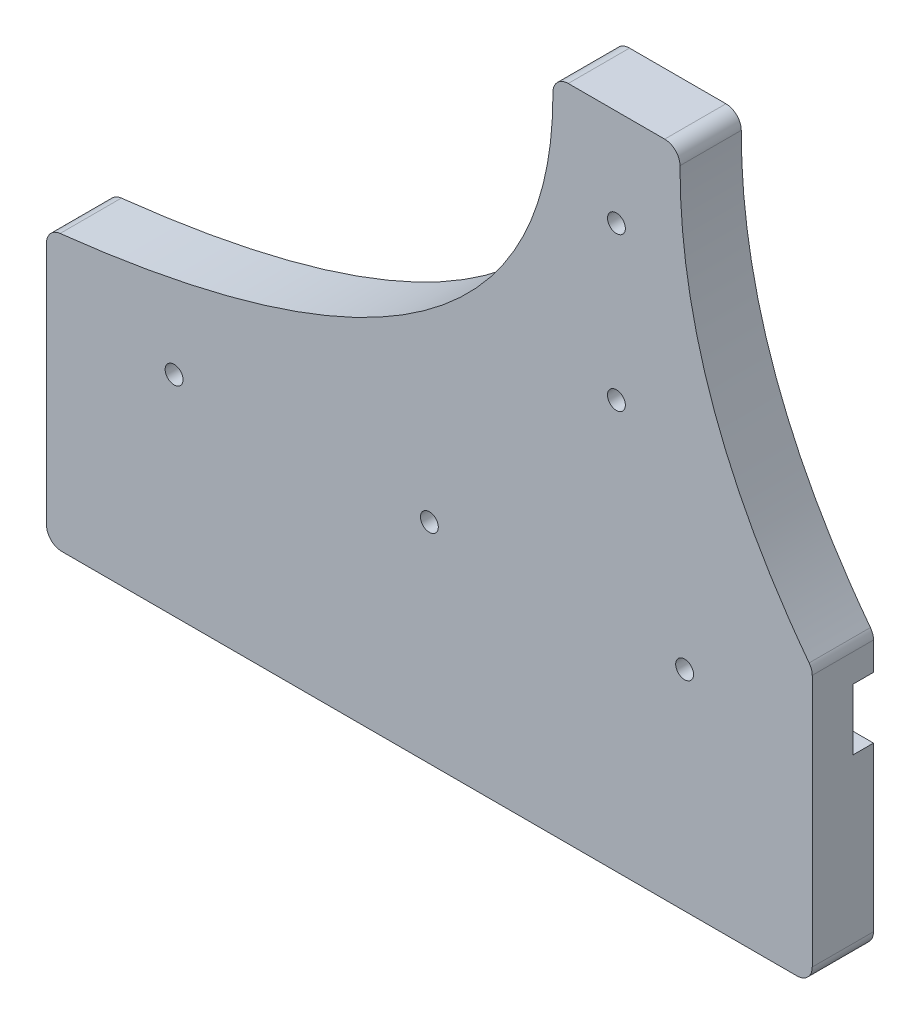
ISO-10303-21;
HEADER;
FILE_DESCRIPTION(('STEP AP214'),'2;1');
FILE_NAME('part.step','',(''),(''),'','','');
FILE_SCHEMA(('AUTOMOTIVE_DESIGN { 1 0 10303 214 1 1 1 1 }'));
ENDSEC;
DATA;
#1=APPLICATION_CONTEXT('core data for automotive mechanical design processes');
#2=APPLICATION_PROTOCOL_DEFINITION('international standard','automotive_design',2000,#1);
#3=PRODUCT_CONTEXT('',#1,'mechanical');
#4=PRODUCT('Part','Part','',(#3));
#5=PRODUCT_RELATED_PRODUCT_CATEGORY('part','',(#4));
#6=PRODUCT_DEFINITION_FORMATION('','',#4);
#7=PRODUCT_DEFINITION_CONTEXT('part definition',#1,'design');
#8=PRODUCT_DEFINITION('design','',#6,#7);
#9=PRODUCT_DEFINITION_SHAPE('','',#8);
#10=(LENGTH_UNIT() NAMED_UNIT(*) SI_UNIT(.MILLI.,.METRE.));
#11=(NAMED_UNIT(*) PLANE_ANGLE_UNIT() SI_UNIT($,.RADIAN.));
#12=(NAMED_UNIT(*) SI_UNIT($,.STERADIAN.) SOLID_ANGLE_UNIT());
#13=UNCERTAINTY_MEASURE_WITH_UNIT(LENGTH_MEASURE(1.E-05),#10,'distance_accuracy_value','');
#14=(GEOMETRIC_REPRESENTATION_CONTEXT(3) GLOBAL_UNCERTAINTY_ASSIGNED_CONTEXT((#13)) GLOBAL_UNIT_ASSIGNED_CONTEXT((#10,
#11,#12)) REPRESENTATION_CONTEXT('',''));
#15=CARTESIAN_POINT('',(0.,0.,0.));
#16=DIRECTION('',(0.,0.,1.));
#17=DIRECTION('',(1.,0.,0.));
#18=AXIS2_PLACEMENT_3D('',#15,#16,#17);
#19=CARTESIAN_POINT('',(-75.,0.,12.));
#20=DIRECTION('',(-1.,0.,0.));
#21=DIRECTION('',(0.,0.,1.));
#22=AXIS2_PLACEMENT_3D('',#19,#20,#21);
#23=PLANE('',#22);
#24=DIRECTION('',(0.,1.,0.));
#25=VECTOR('',#24,1.);
#26=CARTESIAN_POINT('',(-75.,0.,0.));
#27=LINE('',#26,#25);
#28=CARTESIAN_POINT('',(-75.,-38.,0.));
#29=VERTEX_POINT('',#28);
#30=CARTESIAN_POINT('',(-75.,-5.99999999999999,0.));
#31=VERTEX_POINT('',#30);
#32=EDGE_CURVE('E364',#29,#31,#27,.T.);
#33=ORIENTED_EDGE('',*,*,#32,.F.);
#34=DIRECTION('',(0.,0.,-1.));
#35=VECTOR('',#34,1.);
#36=CARTESIAN_POINT('',(-75.,-38.,12.));
#37=LINE('',#36,#35);
#38=CARTESIAN_POINT('',(-75.,-38.,12.));
#39=VERTEX_POINT('',#38);
#40=EDGE_CURVE('E419',#29,#39,#37,.F.);
#41=ORIENTED_EDGE('',*,*,#40,.T.);
#42=DIRECTION('',(0.,1.,0.));
#43=VECTOR('',#42,1.);
#44=CARTESIAN_POINT('',(-75.,0.,12.));
#45=LINE('',#44,#43);
#46=CARTESIAN_POINT('',(-75.,9.80397932276526,12.));
#47=VERTEX_POINT('',#46);
#48=EDGE_CURVE('E321',#39,#47,#45,.T.);
#49=ORIENTED_EDGE('',*,*,#48,.T.);
#50=DIRECTION('',(0.,0.,1.));
#51=VECTOR('',#50,1.);
#52=CARTESIAN_POINT('',(-75.,9.80397932276526,0.));
#53=LINE('',#52,#51);
#54=CARTESIAN_POINT('',(-75.,9.80397932276526,0.));
#55=VERTEX_POINT('',#54);
#56=EDGE_CURVE('E416',#47,#55,#53,.F.);
#57=ORIENTED_EDGE('',*,*,#56,.T.);
#58=CARTESIAN_POINT('',(-75.,6.00000000000002,0.));
#59=VERTEX_POINT('',#58);
#60=EDGE_CURVE('E363',#59,#55,#27,.T.);
#61=ORIENTED_EDGE('',*,*,#60,.F.);
#62=DIRECTION('',(0.,0.,-1.));
#63=VECTOR('',#62,1.);
#64=CARTESIAN_POINT('',(-75.,6.00000000000002,4.));
#65=LINE('',#64,#63);
#66=CARTESIAN_POINT('',(-75.,6.00000000000002,4.));
#67=VERTEX_POINT('',#66);
#68=EDGE_CURVE('E227',#67,#59,#65,.T.);
#69=ORIENTED_EDGE('',*,*,#68,.F.);
#70=DIRECTION('',(0.,-1.,0.));
#71=VECTOR('',#70,1.);
#72=CARTESIAN_POINT('',(-75.,6.00000000000002,4.));
#73=LINE('',#72,#71);
#74=CARTESIAN_POINT('',(-75.,-5.99999999999999,4.));
#75=VERTEX_POINT('',#74);
#76=EDGE_CURVE('E232',#67,#75,#73,.T.);
#77=ORIENTED_EDGE('',*,*,#76,.T.);
#78=DIRECTION('',(0.,0.,-1.));
#79=VECTOR('',#78,1.);
#80=CARTESIAN_POINT('',(-75.,-5.99999999999999,4.));
#81=LINE('',#80,#79);
#82=EDGE_CURVE('E229',#75,#31,#81,.T.);
#83=ORIENTED_EDGE('',*,*,#82,.T.);
#84=EDGE_LOOP('',(#33,#41,#49,#57,#61,#69,#77,#83));
#85=FACE_BOUND('',#84,.T.);
#86=ADVANCED_FACE('F37',(#85),#23,.T.);
#87=CARTESIAN_POINT('',(0.,0.,12.));
#88=DIRECTION('',(0.,0.,-1.));
#89=DIRECTION('',(-1.,0.,0.));
#90=AXIS2_PLACEMENT_3D('',#87,#88,#89);
#91=CYLINDRICAL_SURFACE('',#90,1.75);
#92=CARTESIAN_POINT('',(0.,0.,12.));
#93=DIRECTION('',(0.,0.,1.));
#94=DIRECTION('',(1.,0.,0.));
#95=AXIS2_PLACEMENT_3D('',#92,#93,#94);
#96=CIRCLE('',#95,1.75);
#97=CARTESIAN_POINT('',(1.75,0.,12.));
#98=VERTEX_POINT('',#97);
#99=EDGE_CURVE('E342',#98,#98,#96,.T.);
#100=ORIENTED_EDGE('',*,*,#99,.T.);
#101=EDGE_LOOP('',(#100));
#102=FACE_BOUND('',#101,.T.);
#103=CARTESIAN_POINT('',(0.,0.,4.));
#104=DIRECTION('',(0.,0.,-1.));
#105=DIRECTION('',(-1.,0.,0.));
#106=AXIS2_PLACEMENT_3D('',#103,#104,#105);
#107=CIRCLE('',#106,1.75);
#108=CARTESIAN_POINT('',(-1.75,0.,4.));
#109=VERTEX_POINT('',#108);
#110=EDGE_CURVE('E251',#109,#109,#107,.T.);
#111=ORIENTED_EDGE('',*,*,#110,.T.);
#112=EDGE_LOOP('',(#111));
#113=FACE_BOUND('',#112,.T.);
#114=ADVANCED_FACE('F299',(#102,#113),#91,.F.);
#115=CARTESIAN_POINT('',(50.,0.,12.));
#116=DIRECTION('',(0.,0.,-1.));
#117=DIRECTION('',(-1.,0.,0.));
#118=AXIS2_PLACEMENT_3D('',#115,#116,#117);
#119=CYLINDRICAL_SURFACE('',#118,1.75);
#120=CARTESIAN_POINT('',(50.,0.,12.));
#121=DIRECTION('',(0.,0.,1.));
#122=DIRECTION('',(1.,0.,0.));
#123=AXIS2_PLACEMENT_3D('',#120,#121,#122);
#124=CIRCLE('',#123,1.75);
#125=CARTESIAN_POINT('',(51.75,0.,12.));
#126=VERTEX_POINT('',#125);
#127=EDGE_CURVE('E339',#126,#126,#124,.T.);
#128=ORIENTED_EDGE('',*,*,#127,.T.);
#129=EDGE_LOOP('',(#128));
#130=FACE_BOUND('',#129,.T.);
#131=CARTESIAN_POINT('',(50.,0.,4.));
#132=DIRECTION('',(0.,0.,-1.));
#133=DIRECTION('',(-1.,0.,0.));
#134=AXIS2_PLACEMENT_3D('',#131,#132,#133);
#135=CIRCLE('',#134,1.75);
#136=CARTESIAN_POINT('',(48.25,0.,4.));
#137=VERTEX_POINT('',#136);
#138=EDGE_CURVE('E248',#137,#137,#135,.T.);
#139=ORIENTED_EDGE('',*,*,#138,.T.);
#140=EDGE_LOOP('',(#139));
#141=FACE_BOUND('',#140,.T.);
#142=ADVANCED_FACE('F305',(#130,#141),#119,.F.);
#143=CARTESIAN_POINT('',(75.,0.,12.));
#144=DIRECTION('',(1.,0.,0.));
#145=DIRECTION('',(0.,0.,-1.));
#146=AXIS2_PLACEMENT_3D('',#143,#144,#145);
#147=PLANE('',#146);
#148=DIRECTION('',(0.,-1.,0.));
#149=VECTOR('',#148,1.);
#150=CARTESIAN_POINT('',(75.,0.,12.));
#151=LINE('',#150,#149);
#152=CARTESIAN_POINT('',(75.,11.4873755573327,12.));
#153=VERTEX_POINT('',#152);
#154=CARTESIAN_POINT('',(75.,-38.,12.));
#155=VERTEX_POINT('',#154);
#156=EDGE_CURVE('E330',#153,#155,#151,.T.);
#157=ORIENTED_EDGE('',*,*,#156,.T.);
#158=DIRECTION('',(0.,0.,-1.));
#159=VECTOR('',#158,1.);
#160=CARTESIAN_POINT('',(75.,-38.,12.));
#161=LINE('',#160,#159);
#162=CARTESIAN_POINT('',(75.,-38.,0.));
#163=VERTEX_POINT('',#162);
#164=EDGE_CURVE('E377',#155,#163,#161,.T.);
#165=ORIENTED_EDGE('',*,*,#164,.T.);
#166=DIRECTION('',(0.,-1.,0.));
#167=VECTOR('',#166,1.);
#168=CARTESIAN_POINT('',(75.,0.,0.));
#169=LINE('',#168,#167);
#170=CARTESIAN_POINT('',(75.,-5.99999999999999,0.));
#171=VERTEX_POINT('',#170);
#172=EDGE_CURVE('E372',#171,#163,#169,.T.);
#173=ORIENTED_EDGE('',*,*,#172,.F.);
#174=DIRECTION('',(0.,0.,-1.));
#175=VECTOR('',#174,1.);
#176=CARTESIAN_POINT('',(75.,-5.99999999999999,4.));
#177=LINE('',#176,#175);
#178=CARTESIAN_POINT('',(75.,-5.99999999999999,4.));
#179=VERTEX_POINT('',#178);
#180=EDGE_CURVE('E222',#179,#171,#177,.T.);
#181=ORIENTED_EDGE('',*,*,#180,.F.);
#182=DIRECTION('',(0.,-1.,0.));
#183=VECTOR('',#182,1.);
#184=CARTESIAN_POINT('',(75.,6.00000000000002,4.));
#185=LINE('',#184,#183);
#186=CARTESIAN_POINT('',(75.,6.00000000000002,4.));
#187=VERTEX_POINT('',#186);
#188=EDGE_CURVE('E244',#187,#179,#185,.T.);
#189=ORIENTED_EDGE('',*,*,#188,.F.);
#190=DIRECTION('',(0.,0.,-1.));
#191=VECTOR('',#190,1.);
#192=CARTESIAN_POINT('',(75.,6.00000000000002,4.));
#193=LINE('',#192,#191);
#194=CARTESIAN_POINT('',(75.,6.00000000000002,0.));
#195=VERTEX_POINT('',#194);
#196=EDGE_CURVE('E224',#187,#195,#193,.T.);
#197=ORIENTED_EDGE('',*,*,#196,.T.);
#198=CARTESIAN_POINT('',(75.,11.4873755573327,0.));
#199=VERTEX_POINT('',#198);
#200=EDGE_CURVE('E262',#199,#195,#169,.T.);
#201=ORIENTED_EDGE('',*,*,#200,.F.);
#202=DIRECTION('',(0.,0.,-1.));
#203=VECTOR('',#202,1.);
#204=CARTESIAN_POINT('',(75.,11.4873755573327,12.));
#205=LINE('',#204,#203);
#206=EDGE_CURVE('E348',#199,#153,#205,.F.);
#207=ORIENTED_EDGE('',*,*,#206,.T.);
#208=EDGE_LOOP('',(#157,#165,#173,#181,#189,#197,#201,#207));
#209=FACE_BOUND('',#208,.T.);
#210=ADVANCED_FACE('F448',(#209),#147,.T.);
#211=CARTESIAN_POINT('',(-50.,0.,12.));
#212=DIRECTION('',(0.,0.,-1.));
#213=DIRECTION('',(-1.,0.,0.));
#214=AXIS2_PLACEMENT_3D('',#211,#212,#213);
#215=CYLINDRICAL_SURFACE('',#214,1.75);
#216=CARTESIAN_POINT('',(-50.,0.,12.));
#217=DIRECTION('',(0.,0.,1.));
#218=DIRECTION('',(1.,0.,0.));
#219=AXIS2_PLACEMENT_3D('',#216,#217,#218);
#220=CIRCLE('',#219,1.75);
#221=CARTESIAN_POINT('',(-48.25,0.,12.));
#222=VERTEX_POINT('',#221);
#223=EDGE_CURVE('E345',#222,#222,#220,.T.);
#224=ORIENTED_EDGE('',*,*,#223,.T.);
#225=EDGE_LOOP('',(#224));
#226=FACE_BOUND('',#225,.T.);
#227=CARTESIAN_POINT('',(-50.,0.,4.));
#228=DIRECTION('',(0.,0.,-1.));
#229=DIRECTION('',(-1.,0.,0.));
#230=AXIS2_PLACEMENT_3D('',#227,#228,#229);
#231=CIRCLE('',#230,1.75);
#232=CARTESIAN_POINT('',(-51.75,0.,4.));
#233=VERTEX_POINT('',#232);
#234=EDGE_CURVE('E184',#233,#233,#231,.T.);
#235=ORIENTED_EDGE('',*,*,#234,.T.);
#236=EDGE_LOOP('',(#235));
#237=FACE_BOUND('',#236,.T.);
#238=ADVANCED_FACE('F631',(#226,#237),#215,.F.);
#239=CARTESIAN_POINT('',(0.,0.,0.));
#240=DIRECTION('',(0.,0.,1.));
#241=DIRECTION('',(1.,0.,0.));
#242=AXIS2_PLACEMENT_3D('',#239,#240,#241);
#243=PLANE('',#242);
#244=ORIENTED_EDGE('',*,*,#172,.T.);
#245=CARTESIAN_POINT('',(72.,-38.,0.));
#246=DIRECTION('',(0.,0.,1.));
#247=DIRECTION('',(1.,0.,0.));
#248=AXIS2_PLACEMENT_3D('',#245,#246,#247);
#249=CIRCLE('',#248,3.);
#250=CARTESIAN_POINT('',(72.,-41.,0.));
#251=VERTEX_POINT('',#250);
#252=EDGE_CURVE('E382',#163,#251,#249,.F.);
#253=ORIENTED_EDGE('',*,*,#252,.T.);
#254=DIRECTION('',(-1.,0.,0.));
#255=VECTOR('',#254,1.);
#256=CARTESIAN_POINT('',(0.,-41.,0.));
#257=LINE('',#256,#255);
#258=CARTESIAN_POINT('',(-72.,-41.,0.));
#259=VERTEX_POINT('',#258);
#260=EDGE_CURVE('E369',#251,#259,#257,.T.);
#261=ORIENTED_EDGE('',*,*,#260,.T.);
#262=CARTESIAN_POINT('',(-72.,-38.,0.));
#263=DIRECTION('',(0.,0.,1.));
#264=DIRECTION('',(1.,0.,0.));
#265=AXIS2_PLACEMENT_3D('',#262,#263,#264);
#266=CIRCLE('',#265,3.);
#267=EDGE_CURVE('E380',#259,#29,#266,.F.);
#268=ORIENTED_EDGE('',*,*,#267,.T.);
#269=ORIENTED_EDGE('',*,*,#32,.T.);
#270=DIRECTION('',(1.,0.,0.));
#271=VECTOR('',#270,1.);
#272=CARTESIAN_POINT('',(-75.,-5.99999999999999,0.));
#273=LINE('',#272,#271);
#274=EDGE_CURVE('E208',#31,#171,#273,.T.);
#275=ORIENTED_EDGE('',*,*,#274,.T.);
#276=EDGE_LOOP('',(#244,#253,#261,#268,#269,#275));
#277=FACE_BOUND('',#276,.T.);
#278=ADVANCED_FACE('F273',(#277),#243,.F.);
#279=CARTESIAN_POINT('',(49.14,88.,12.));
#280=CARTESIAN_POINT('',(47.9994288545834,47.6999038838313,12.));
#281=CARTESIAN_POINT('',(75.,12.5,12.));
#282=B_SPLINE_CURVE_WITH_KNOTS('',2,(#279,#280,#281),.UNSPECIFIED.,.F.,.F.,(3,3),(0.,1.),.UNSPECIFIED.);
#283=DIRECTION('',(0.,0.,-1.));
#284=VECTOR('',#283,1.);
#285=SURFACE_OF_LINEAR_EXTRUSION('',#282,#284);
#286=CARTESIAN_POINT('',(49.0940495349071,84.9933925839309,12.));
#287=VERTEX_POINT('',#286);
#288=CARTESIAN_POINT('',(74.3922031068026,13.2977247766282,12.));
#289=VERTEX_POINT('',#288);
#290=EDGE_CURVE('E255',#287,#289,#282,.T.);
#291=ORIENTED_EDGE('',*,*,#290,.T.);
#292=DIRECTION('',(0.,0.,-1.));
#293=VECTOR('',#292,1.);
#294=CARTESIAN_POINT('',(74.3922031068026,13.2977247766282,12.));
#295=LINE('',#294,#293);
#296=CARTESIAN_POINT('',(74.3922031068026,13.2977247766282,0.));
#297=VERTEX_POINT('',#296);
#298=EDGE_CURVE('E403',#289,#297,#295,.T.);
#299=ORIENTED_EDGE('',*,*,#298,.T.);
#300=CARTESIAN_POINT('',(49.14,88.,0.));
#301=CARTESIAN_POINT('',(47.9994288545834,47.6999038838313,0.));
#302=CARTESIAN_POINT('',(75.,12.5,0.));
#303=B_SPLINE_CURVE_WITH_KNOTS('',2,(#300,#301,#302),.UNSPECIFIED.,.F.,.F.,(3,3),(0.,1.),.UNSPECIFIED.);
#304=CARTESIAN_POINT('',(49.0940495349071,84.9933925839309,0.));
#305=VERTEX_POINT('',#304);
#306=EDGE_CURVE('E254',#305,#297,#303,.T.);
#307=ORIENTED_EDGE('',*,*,#306,.F.);
#308=DIRECTION('',(0.,0.,-1.));
#309=VECTOR('',#308,1.);
#310=CARTESIAN_POINT('',(49.0940495349071,84.9933925839309,0.));
#311=LINE('',#310,#309);
#312=EDGE_CURVE('E401',#305,#287,#311,.F.);
#313=ORIENTED_EDGE('',*,*,#312,.T.);
#314=EDGE_LOOP('',(#291,#299,#307,#313));
#315=FACE_BOUND('',#314,.T.);
#316=ADVANCED_FACE('F268',(#315),#285,.T.);
#317=CARTESIAN_POINT('',(0.,88.,12.));
#318=DIRECTION('',(0.,1.,0.));
#319=DIRECTION('',(0.,0.,1.));
#320=AXIS2_PLACEMENT_3D('',#317,#318,#319);
#321=PLANE('',#320);
#322=DIRECTION('',(1.,0.,0.));
#323=VECTOR('',#322,1.);
#324=CARTESIAN_POINT('',(0.,88.,12.));
#325=LINE('',#324,#323);
#326=CARTESIAN_POINT('',(27.2076035945309,88.,12.));
#327=VERTEX_POINT('',#326);
#328=CARTESIAN_POINT('',(46.0940568112405,88.,12.));
#329=VERTEX_POINT('',#328);
#330=EDGE_CURVE('E261',#327,#329,#325,.T.);
#331=ORIENTED_EDGE('',*,*,#330,.T.);
#332=DIRECTION('',(0.,0.,-1.));
#333=VECTOR('',#332,1.);
#334=CARTESIAN_POINT('',(46.0940568112405,88.,12.));
#335=LINE('',#334,#333);
#336=CARTESIAN_POINT('',(46.0940568112405,88.,0.));
#337=VERTEX_POINT('',#336);
#338=EDGE_CURVE('E414',#329,#337,#335,.T.);
#339=ORIENTED_EDGE('',*,*,#338,.T.);
#340=DIRECTION('',(1.,0.,0.));
#341=VECTOR('',#340,1.);
#342=CARTESIAN_POINT('',(0.,88.,0.));
#343=LINE('',#342,#341);
#344=CARTESIAN_POINT('',(27.2076035945309,88.,0.));
#345=VERTEX_POINT('',#344);
#346=EDGE_CURVE('E353',#345,#337,#343,.T.);
#347=ORIENTED_EDGE('',*,*,#346,.F.);
#348=DIRECTION('',(0.,0.,1.));
#349=VECTOR('',#348,1.);
#350=CARTESIAN_POINT('',(27.2076035945309,88.,12.));
#351=LINE('',#350,#349);
#352=EDGE_CURVE('E412',#345,#327,#351,.T.);
#353=ORIENTED_EDGE('',*,*,#352,.T.);
#354=EDGE_LOOP('',(#331,#339,#347,#353));
#355=FACE_BOUND('',#354,.T.);
#356=ADVANCED_FACE('F272',(#355),#321,.T.);
#357=CARTESIAN_POINT('',(24.14,88.,12.));
#358=CARTESIAN_POINT('',(26.8075250425596,22.9625614657823,12.));
#359=CARTESIAN_POINT('',(-75.,12.5,12.));
#360=B_SPLINE_CURVE_WITH_KNOTS('',2,(#357,#358,#359),.UNSPECIFIED.,.F.,.F.,(3,3),(0.,1.),.UNSPECIFIED.);
#361=DIRECTION('',(0.,0.,-1.));
#362=VECTOR('',#361,1.);
#363=SURFACE_OF_LINEAR_EXTRUSION('',#360,#362);
#364=CARTESIAN_POINT('',(24.14,88.,0.));
#365=CARTESIAN_POINT('',(26.8075250425596,22.9625614657823,0.));
#366=CARTESIAN_POINT('',(-75.,12.5,0.));
#367=B_SPLINE_CURVE_WITH_KNOTS('',2,(#364,#365,#366),.UNSPECIFIED.,.F.,.F.,(3,3),(0.,1.),.UNSPECIFIED.);
#368=CARTESIAN_POINT('',(24.207622352341,84.9893912060903,0.));
#369=VERTEX_POINT('',#368);
#370=CARTESIAN_POINT('',(-72.3319906743854,12.7855531005077,0.));
#371=VERTEX_POINT('',#370);
#372=EDGE_CURVE('E358',#369,#371,#367,.T.);
#373=ORIENTED_EDGE('',*,*,#372,.T.);
#374=DIRECTION('',(0.,0.,-1.));
#375=VECTOR('',#374,1.);
#376=CARTESIAN_POINT('',(-72.3319906743832,12.7855531005079,0.));
#377=LINE('',#376,#375);
#378=CARTESIAN_POINT('',(-72.3319906743854,12.7855531005077,12.));
#379=VERTEX_POINT('',#378);
#380=EDGE_CURVE('E11',#371,#379,#377,.F.);
#381=ORIENTED_EDGE('',*,*,#380,.T.);
#382=CARTESIAN_POINT('',(24.207622352341,84.9893912060903,12.));
#383=VERTEX_POINT('',#382);
#384=EDGE_CURVE('E315',#383,#379,#360,.T.);
#385=ORIENTED_EDGE('',*,*,#384,.F.);
#386=DIRECTION('',(0.,0.,-1.));
#387=VECTOR('',#386,1.);
#388=CARTESIAN_POINT('',(24.2076223523409,84.9893912060903,12.));
#389=LINE('',#388,#387);
#390=EDGE_CURVE('E45',#383,#369,#389,.T.);
#391=ORIENTED_EDGE('',*,*,#390,.T.);
#392=EDGE_LOOP('',(#373,#381,#385,#391));
#393=FACE_BOUND('',#392,.T.);
#394=ADVANCED_FACE('F312',(#393),#363,.F.);
#395=CARTESIAN_POINT('',(0.,-41.,12.));
#396=DIRECTION('',(0.,-1.,0.));
#397=DIRECTION('',(0.,0.,-1.));
#398=AXIS2_PLACEMENT_3D('',#395,#396,#397);
#399=PLANE('',#398);
#400=ORIENTED_EDGE('',*,*,#260,.F.);
#401=DIRECTION('',(0.,0.,-1.));
#402=VECTOR('',#401,1.);
#403=CARTESIAN_POINT('',(72.,-41.,12.));
#404=LINE('',#403,#402);
#405=CARTESIAN_POINT('',(72.,-41.,12.));
#406=VERTEX_POINT('',#405);
#407=EDGE_CURVE('E387',#251,#406,#404,.F.);
#408=ORIENTED_EDGE('',*,*,#407,.T.);
#409=DIRECTION('',(-1.,0.,0.));
#410=VECTOR('',#409,1.);
#411=CARTESIAN_POINT('',(0.,-41.,12.));
#412=LINE('',#411,#410);
#413=CARTESIAN_POINT('',(-72.,-41.,12.));
#414=VERTEX_POINT('',#413);
#415=EDGE_CURVE('E327',#406,#414,#412,.T.);
#416=ORIENTED_EDGE('',*,*,#415,.T.);
#417=DIRECTION('',(0.,0.,-1.));
#418=VECTOR('',#417,1.);
#419=CARTESIAN_POINT('',(-72.,-41.,12.));
#420=LINE('',#419,#418);
#421=EDGE_CURVE('E384',#414,#259,#420,.T.);
#422=ORIENTED_EDGE('',*,*,#421,.T.);
#423=EDGE_LOOP('',(#400,#408,#416,#422));
#424=FACE_BOUND('',#423,.T.);
#425=ADVANCED_FACE('F310',(#424),#399,.T.);
#426=CARTESIAN_POINT('',(36.64,69.,12.));
#427=DIRECTION('',(0.,0.,-1.));
#428=DIRECTION('',(-1.,0.,0.));
#429=AXIS2_PLACEMENT_3D('',#426,#427,#428);
#430=CYLINDRICAL_SURFACE('',#429,1.75);
#431=CARTESIAN_POINT('',(36.64,69.,4.));
#432=DIRECTION('',(0.,0.,1.));
#433=DIRECTION('',(1.,0.,0.));
#434=AXIS2_PLACEMENT_3D('',#431,#432,#433);
#435=CIRCLE('',#434,1.75);
#436=CARTESIAN_POINT('',(38.39,69.,4.));
#437=VERTEX_POINT('',#436);
#438=EDGE_CURVE('E194',#437,#437,#435,.T.);
#439=ORIENTED_EDGE('',*,*,#438,.F.);
#440=EDGE_LOOP('',(#439));
#441=FACE_BOUND('',#440,.T.);
#442=CARTESIAN_POINT('',(36.64,69.,12.));
#443=DIRECTION('',(0.,0.,1.));
#444=DIRECTION('',(1.,0.,0.));
#445=AXIS2_PLACEMENT_3D('',#442,#443,#444);
#446=CIRCLE('',#445,1.75);
#447=CARTESIAN_POINT('',(38.39,69.,12.));
#448=VERTEX_POINT('',#447);
#449=EDGE_CURVE('E336',#448,#448,#446,.T.);
#450=ORIENTED_EDGE('',*,*,#449,.T.);
#451=EDGE_LOOP('',(#450));
#452=FACE_BOUND('',#451,.T.);
#453=ADVANCED_FACE('F478',(#441,#452),#430,.F.);
#454=CARTESIAN_POINT('',(36.64,39.,12.));
#455=DIRECTION('',(0.,0.,-1.));
#456=DIRECTION('',(-1.,0.,0.));
#457=AXIS2_PLACEMENT_3D('',#454,#455,#456);
#458=CYLINDRICAL_SURFACE('',#457,1.75);
#459=CARTESIAN_POINT('',(36.64,39.,4.));
#460=DIRECTION('',(0.,0.,1.));
#461=DIRECTION('',(1.,0.,0.));
#462=AXIS2_PLACEMENT_3D('',#459,#460,#461);
#463=CIRCLE('',#462,1.75);
#464=CARTESIAN_POINT('',(38.39,39.,4.));
#465=VERTEX_POINT('',#464);
#466=EDGE_CURVE('E216',#465,#465,#463,.T.);
#467=ORIENTED_EDGE('',*,*,#466,.F.);
#468=EDGE_LOOP('',(#467));
#469=FACE_BOUND('',#468,.T.);
#470=CARTESIAN_POINT('',(36.64,39.,12.));
#471=DIRECTION('',(0.,0.,1.));
#472=DIRECTION('',(1.,0.,0.));
#473=AXIS2_PLACEMENT_3D('',#470,#471,#472);
#474=CIRCLE('',#473,1.75);
#475=CARTESIAN_POINT('',(38.39,39.,12.));
#476=VERTEX_POINT('',#475);
#477=EDGE_CURVE('E333',#476,#476,#474,.T.);
#478=ORIENTED_EDGE('',*,*,#477,.T.);
#479=EDGE_LOOP('',(#478));
#480=FACE_BOUND('',#479,.T.);
#481=ADVANCED_FACE('F485',(#469,#480),#458,.F.);
#482=CARTESIAN_POINT('',(0.,0.,12.));
#483=DIRECTION('',(0.,0.,1.));
#484=DIRECTION('',(1.,0.,0.));
#485=AXIS2_PLACEMENT_3D('',#482,#483,#484);
#486=PLANE('',#485);
#487=ORIENTED_EDGE('',*,*,#415,.F.);
#488=CARTESIAN_POINT('',(72.,-38.,12.));
#489=DIRECTION('',(0.,0.,1.));
#490=DIRECTION('',(1.,0.,0.));
#491=AXIS2_PLACEMENT_3D('',#488,#489,#490);
#492=CIRCLE('',#491,3.);
#493=EDGE_CURVE('E399',#406,#155,#492,.T.);
#494=ORIENTED_EDGE('',*,*,#493,.T.);
#495=ORIENTED_EDGE('',*,*,#156,.F.);
#496=CARTESIAN_POINT('',(72.,11.4873755573327,12.));
#497=DIRECTION('',(0.,0.,1.));
#498=DIRECTION('',(1.,0.,0.));
#499=AXIS2_PLACEMENT_3D('',#496,#497,#498);
#500=CIRCLE('',#499,3.);
#501=EDGE_CURVE('E397',#153,#289,#500,.T.);
#502=ORIENTED_EDGE('',*,*,#501,.T.);
#503=ORIENTED_EDGE('',*,*,#290,.F.);
#504=CARTESIAN_POINT('',(46.0940568112405,85.,12.));
#505=DIRECTION('',(0.,0.,1.));
#506=DIRECTION('',(1.,0.,0.));
#507=AXIS2_PLACEMENT_3D('',#504,#505,#506);
#508=CIRCLE('',#507,3.);
#509=EDGE_CURVE('E395',#287,#329,#508,.T.);
#510=ORIENTED_EDGE('',*,*,#509,.T.);
#511=ORIENTED_EDGE('',*,*,#330,.F.);
#512=CARTESIAN_POINT('',(27.2076035945309,85.,12.));
#513=DIRECTION('',(0.,0.,1.));
#514=DIRECTION('',(1.,0.,0.));
#515=AXIS2_PLACEMENT_3D('',#512,#513,#514);
#516=CIRCLE('',#515,3.);
#517=EDGE_CURVE('E389',#327,#383,#516,.T.);
#518=ORIENTED_EDGE('',*,*,#517,.T.);
#519=ORIENTED_EDGE('',*,*,#384,.T.);
#520=CARTESIAN_POINT('',(-72.,9.80397932276526,12.));
#521=DIRECTION('',(0.,0.,1.));
#522=DIRECTION('',(1.,0.,0.));
#523=AXIS2_PLACEMENT_3D('',#520,#521,#522);
#524=CIRCLE('',#523,3.);
#525=EDGE_CURVE('E391',#379,#47,#524,.T.);
#526=ORIENTED_EDGE('',*,*,#525,.T.);
#527=ORIENTED_EDGE('',*,*,#48,.F.);
#528=CARTESIAN_POINT('',(-72.,-38.,12.));
#529=DIRECTION('',(0.,0.,1.));
#530=DIRECTION('',(1.,0.,0.));
#531=AXIS2_PLACEMENT_3D('',#528,#529,#530);
#532=CIRCLE('',#531,3.);
#533=EDGE_CURVE('E393',#39,#414,#532,.T.);
#534=ORIENTED_EDGE('',*,*,#533,.T.);
#535=EDGE_LOOP('',(#487,#494,#495,#502,#503,#510,#511,#518,#519,#526,#527,#534));
#536=FACE_BOUND('',#535,.T.);
#537=ORIENTED_EDGE('',*,*,#477,.F.);
#538=EDGE_LOOP('',(#537));
#539=FACE_BOUND('',#538,.T.);
#540=ORIENTED_EDGE('',*,*,#449,.F.);
#541=EDGE_LOOP('',(#540));
#542=FACE_BOUND('',#541,.T.);
#543=ORIENTED_EDGE('',*,*,#127,.F.);
#544=EDGE_LOOP('',(#543));
#545=FACE_BOUND('',#544,.T.);
#546=ORIENTED_EDGE('',*,*,#99,.F.);
#547=EDGE_LOOP('',(#546));
#548=FACE_BOUND('',#547,.T.);
#549=ORIENTED_EDGE('',*,*,#223,.F.);
#550=EDGE_LOOP('',(#549));
#551=FACE_BOUND('',#550,.T.);
#552=ADVANCED_FACE('F436',(#536,#539,#542,#545,#548,#551),#486,.T.);
#553=DIRECTION('',(1.,0.,0.));
#554=VECTOR('',#553,1.);
#555=CARTESIAN_POINT('',(0.,26.5,0.));
#556=LINE('',#555,#554);
#557=CARTESIAN_POINT('',(30.64,26.5,0.));
#558=VERTEX_POINT('',#557);
#559=CARTESIAN_POINT('',(42.64,26.5,0.));
#560=VERTEX_POINT('',#559);
#561=EDGE_CURVE('E213',#558,#560,#556,.T.);
#562=ORIENTED_EDGE('',*,*,#561,.T.);
#563=DIRECTION('',(0.,-1.,0.));
#564=VECTOR('',#563,1.);
#565=CARTESIAN_POINT('',(42.64,0.,0.));
#566=LINE('',#565,#564);
#567=CARTESIAN_POINT('',(42.64,81.5,0.));
#568=VERTEX_POINT('',#567);
#569=EDGE_CURVE('E206',#568,#560,#566,.T.);
#570=ORIENTED_EDGE('',*,*,#569,.F.);
#571=DIRECTION('',(1.,0.,0.));
#572=VECTOR('',#571,1.);
#573=CARTESIAN_POINT('',(0.,81.5,0.));
#574=LINE('',#573,#572);
#575=CARTESIAN_POINT('',(30.64,81.5,0.));
#576=VERTEX_POINT('',#575);
#577=EDGE_CURVE('E181',#576,#568,#574,.T.);
#578=ORIENTED_EDGE('',*,*,#577,.F.);
#579=DIRECTION('',(0.,-1.,0.));
#580=VECTOR('',#579,1.);
#581=CARTESIAN_POINT('',(30.64,0.,0.));
#582=LINE('',#581,#580);
#583=EDGE_CURVE('E210',#576,#558,#582,.T.);
#584=ORIENTED_EDGE('',*,*,#583,.T.);
#585=EDGE_LOOP('',(#562,#570,#578,#584));
#586=FACE_BOUND('',#585,.T.);
#587=ORIENTED_EDGE('',*,*,#306,.T.);
#588=CARTESIAN_POINT('',(72.,11.4873755573327,0.));
#589=DIRECTION('',(0.,0.,1.));
#590=DIRECTION('',(1.,0.,0.));
#591=AXIS2_PLACEMENT_3D('',#588,#589,#590);
#592=CIRCLE('',#591,3.);
#593=EDGE_CURVE('E410',#297,#199,#592,.F.);
#594=ORIENTED_EDGE('',*,*,#593,.T.);
#595=ORIENTED_EDGE('',*,*,#200,.T.);
#596=DIRECTION('',(1.,0.,0.));
#597=VECTOR('',#596,1.);
#598=CARTESIAN_POINT('',(-75.,6.00000000000002,0.));
#599=LINE('',#598,#597);
#600=EDGE_CURVE('E233',#59,#195,#599,.T.);
#601=ORIENTED_EDGE('',*,*,#600,.F.);
#602=ORIENTED_EDGE('',*,*,#60,.T.);
#603=CARTESIAN_POINT('',(-72.,9.80397932276526,0.));
#604=DIRECTION('',(0.,0.,1.));
#605=DIRECTION('',(1.,0.,0.));
#606=AXIS2_PLACEMENT_3D('',#603,#604,#605);
#607=CIRCLE('',#606,3.);
#608=EDGE_CURVE('E407',#55,#371,#607,.F.);
#609=ORIENTED_EDGE('',*,*,#608,.T.);
#610=ORIENTED_EDGE('',*,*,#372,.F.);
#611=CARTESIAN_POINT('',(27.2076035945309,85.,0.));
#612=DIRECTION('',(0.,0.,1.));
#613=DIRECTION('',(1.,0.,0.));
#614=AXIS2_PLACEMENT_3D('',#611,#612,#613);
#615=CIRCLE('',#614,3.);
#616=EDGE_CURVE('E60',#369,#345,#615,.F.);
#617=ORIENTED_EDGE('',*,*,#616,.T.);
#618=ORIENTED_EDGE('',*,*,#346,.T.);
#619=CARTESIAN_POINT('',(46.0940568112405,85.,0.));
#620=DIRECTION('',(0.,0.,1.));
#621=DIRECTION('',(1.,0.,0.));
#622=AXIS2_PLACEMENT_3D('',#619,#620,#621);
#623=CIRCLE('',#622,3.);
#624=EDGE_CURVE('E52',#337,#305,#623,.F.);
#625=ORIENTED_EDGE('',*,*,#624,.T.);
#626=EDGE_LOOP('',(#587,#594,#595,#601,#602,#609,#610,#617,#618,#625));
#627=FACE_BOUND('',#626,.T.);
#628=ADVANCED_FACE('F425',(#586,#627),#243,.F.);
#629=CARTESIAN_POINT('',(-75.,-5.99999999999999,4.));
#630=DIRECTION('',(0.,1.,0.));
#631=DIRECTION('',(0.,0.,1.));
#632=AXIS2_PLACEMENT_3D('',#629,#630,#631);
#633=PLANE('',#632);
#634=ORIENTED_EDGE('',*,*,#274,.F.);
#635=ORIENTED_EDGE('',*,*,#82,.F.);
#636=DIRECTION('',(1.,0.,0.));
#637=VECTOR('',#636,1.);
#638=CARTESIAN_POINT('',(-75.,-5.99999999999999,4.));
#639=LINE('',#638,#637);
#640=EDGE_CURVE('E236',#75,#179,#639,.T.);
#641=ORIENTED_EDGE('',*,*,#640,.T.);
#642=ORIENTED_EDGE('',*,*,#180,.T.);
#643=EDGE_LOOP('',(#634,#635,#641,#642));
#644=FACE_BOUND('',#643,.T.);
#645=ADVANCED_FACE('F507',(#644),#633,.T.);
#646=CARTESIAN_POINT('',(-75.,6.00000000000002,4.));
#647=DIRECTION('',(0.,1.,0.));
#648=DIRECTION('',(0.,0.,1.));
#649=AXIS2_PLACEMENT_3D('',#646,#647,#648);
#650=PLANE('',#649);
#651=ORIENTED_EDGE('',*,*,#600,.T.);
#652=ORIENTED_EDGE('',*,*,#196,.F.);
#653=DIRECTION('',(1.,0.,0.));
#654=VECTOR('',#653,1.);
#655=CARTESIAN_POINT('',(-75.,6.00000000000002,4.));
#656=LINE('',#655,#654);
#657=EDGE_CURVE('E241',#67,#187,#656,.T.);
#658=ORIENTED_EDGE('',*,*,#657,.F.);
#659=ORIENTED_EDGE('',*,*,#68,.T.);
#660=EDGE_LOOP('',(#651,#652,#658,#659));
#661=FACE_BOUND('',#660,.T.);
#662=ADVANCED_FACE('F515',(#661),#650,.F.);
#663=CARTESIAN_POINT('',(0.,0.,4.));
#664=DIRECTION('',(0.,0.,-1.));
#665=DIRECTION('',(-1.,0.,0.));
#666=AXIS2_PLACEMENT_3D('',#663,#664,#665);
#667=PLANE('',#666);
#668=ORIENTED_EDGE('',*,*,#110,.F.);
#669=EDGE_LOOP('',(#668));
#670=FACE_BOUND('',#669,.T.);
#671=ORIENTED_EDGE('',*,*,#138,.F.);
#672=EDGE_LOOP('',(#671));
#673=FACE_BOUND('',#672,.T.);
#674=ORIENTED_EDGE('',*,*,#234,.F.);
#675=EDGE_LOOP('',(#674));
#676=FACE_BOUND('',#675,.T.);
#677=ORIENTED_EDGE('',*,*,#640,.F.);
#678=ORIENTED_EDGE('',*,*,#76,.F.);
#679=ORIENTED_EDGE('',*,*,#657,.T.);
#680=ORIENTED_EDGE('',*,*,#188,.T.);
#681=EDGE_LOOP('',(#677,#678,#679,#680));
#682=FACE_BOUND('',#681,.T.);
#683=ADVANCED_FACE('F523',(#670,#673,#676,#682),#667,.T.);
#684=CARTESIAN_POINT('',(42.64,0.,4.));
#685=DIRECTION('',(1.,0.,0.));
#686=DIRECTION('',(0.,1.,0.));
#687=AXIS2_PLACEMENT_3D('',#684,#685,#686);
#688=PLANE('',#687);
#689=ORIENTED_EDGE('',*,*,#569,.T.);
#690=DIRECTION('',(0.,0.,-1.));
#691=VECTOR('',#690,1.);
#692=CARTESIAN_POINT('',(42.64,26.5,4.));
#693=LINE('',#692,#691);
#694=CARTESIAN_POINT('',(42.64,26.5,4.));
#695=VERTEX_POINT('',#694);
#696=EDGE_CURVE('E192',#695,#560,#693,.T.);
#697=ORIENTED_EDGE('',*,*,#696,.F.);
#698=DIRECTION('',(0.,-1.,0.));
#699=VECTOR('',#698,1.);
#700=CARTESIAN_POINT('',(42.64,0.,4.));
#701=LINE('',#700,#699);
#702=CARTESIAN_POINT('',(42.64,81.5,4.));
#703=VERTEX_POINT('',#702);
#704=EDGE_CURVE('E189',#703,#695,#701,.T.);
#705=ORIENTED_EDGE('',*,*,#704,.F.);
#706=DIRECTION('',(0.,0.,-1.));
#707=VECTOR('',#706,1.);
#708=CARTESIAN_POINT('',(42.64,81.5,4.));
#709=LINE('',#708,#707);
#710=EDGE_CURVE('E175',#703,#568,#709,.T.);
#711=ORIENTED_EDGE('',*,*,#710,.T.);
#712=EDGE_LOOP('',(#689,#697,#705,#711));
#713=FACE_BOUND('',#712,.T.);
#714=ADVANCED_FACE('F190',(#713),#688,.F.);
#715=CARTESIAN_POINT('',(0.,81.5,4.));
#716=DIRECTION('',(0.,1.,0.));
#717=DIRECTION('',(0.,0.,1.));
#718=AXIS2_PLACEMENT_3D('',#715,#716,#717);
#719=PLANE('',#718);
#720=ORIENTED_EDGE('',*,*,#577,.T.);
#721=ORIENTED_EDGE('',*,*,#710,.F.);
#722=DIRECTION('',(1.,0.,0.));
#723=VECTOR('',#722,1.);
#724=CARTESIAN_POINT('',(0.,81.5,4.));
#725=LINE('',#724,#723);
#726=CARTESIAN_POINT('',(30.64,81.5,4.));
#727=VERTEX_POINT('',#726);
#728=EDGE_CURVE('E179',#727,#703,#725,.T.);
#729=ORIENTED_EDGE('',*,*,#728,.F.);
#730=DIRECTION('',(0.,0.,-1.));
#731=VECTOR('',#730,1.);
#732=CARTESIAN_POINT('',(30.64,81.5,4.));
#733=LINE('',#732,#731);
#734=EDGE_CURVE('E185',#727,#576,#733,.T.);
#735=ORIENTED_EDGE('',*,*,#734,.T.);
#736=EDGE_LOOP('',(#720,#721,#729,#735));
#737=FACE_BOUND('',#736,.T.);
#738=ADVANCED_FACE('F177',(#737),#719,.F.);
#739=CARTESIAN_POINT('',(30.64,0.,4.));
#740=DIRECTION('',(1.,0.,0.));
#741=DIRECTION('',(0.,1.,0.));
#742=AXIS2_PLACEMENT_3D('',#739,#740,#741);
#743=PLANE('',#742);
#744=ORIENTED_EDGE('',*,*,#583,.F.);
#745=ORIENTED_EDGE('',*,*,#734,.F.);
#746=DIRECTION('',(0.,-1.,0.));
#747=VECTOR('',#746,1.);
#748=CARTESIAN_POINT('',(30.64,0.,4.));
#749=LINE('',#748,#747);
#750=CARTESIAN_POINT('',(30.64,26.5,4.));
#751=VERTEX_POINT('',#750);
#752=EDGE_CURVE('E199',#727,#751,#749,.T.);
#753=ORIENTED_EDGE('',*,*,#752,.T.);
#754=DIRECTION('',(0.,0.,-1.));
#755=VECTOR('',#754,1.);
#756=CARTESIAN_POINT('',(30.64,26.5,4.));
#757=LINE('',#756,#755);
#758=EDGE_CURVE('E218',#751,#558,#757,.T.);
#759=ORIENTED_EDGE('',*,*,#758,.T.);
#760=EDGE_LOOP('',(#744,#745,#753,#759));
#761=FACE_BOUND('',#760,.T.);
#762=ADVANCED_FACE('F544',(#761),#743,.T.);
#763=CARTESIAN_POINT('',(0.,26.5,4.));
#764=DIRECTION('',(0.,1.,0.));
#765=DIRECTION('',(0.,0.,1.));
#766=AXIS2_PLACEMENT_3D('',#763,#764,#765);
#767=PLANE('',#766);
#768=ORIENTED_EDGE('',*,*,#561,.F.);
#769=ORIENTED_EDGE('',*,*,#758,.F.);
#770=DIRECTION('',(1.,0.,0.));
#771=VECTOR('',#770,1.);
#772=CARTESIAN_POINT('',(0.,26.5,4.));
#773=LINE('',#772,#771);
#774=EDGE_CURVE('E201',#751,#695,#773,.T.);
#775=ORIENTED_EDGE('',*,*,#774,.T.);
#776=ORIENTED_EDGE('',*,*,#696,.T.);
#777=EDGE_LOOP('',(#768,#769,#775,#776));
#778=FACE_BOUND('',#777,.T.);
#779=ADVANCED_FACE('F551',(#778),#767,.T.);
#780=CARTESIAN_POINT('',(0.,0.,4.));
#781=DIRECTION('',(0.,0.,1.));
#782=DIRECTION('',(1.,0.,0.));
#783=AXIS2_PLACEMENT_3D('',#780,#781,#782);
#784=PLANE('',#783);
#785=ORIENTED_EDGE('',*,*,#466,.T.);
#786=EDGE_LOOP('',(#785));
#787=FACE_BOUND('',#786,.T.);
#788=ORIENTED_EDGE('',*,*,#438,.T.);
#789=EDGE_LOOP('',(#788));
#790=FACE_BOUND('',#789,.T.);
#791=ORIENTED_EDGE('',*,*,#704,.T.);
#792=ORIENTED_EDGE('',*,*,#774,.F.);
#793=ORIENTED_EDGE('',*,*,#752,.F.);
#794=ORIENTED_EDGE('',*,*,#728,.T.);
#795=EDGE_LOOP('',(#791,#792,#793,#794));
#796=FACE_BOUND('',#795,.T.);
#797=ADVANCED_FACE('F197',(#787,#790,#796),#784,.F.);
#798=CARTESIAN_POINT('',(72.,-38.,12.));
#799=DIRECTION('',(0.,0.,-1.));
#800=DIRECTION('',(-1.,0.,0.));
#801=AXIS2_PLACEMENT_3D('',#798,#799,#800);
#802=CYLINDRICAL_SURFACE('',#801,3.);
#803=ORIENTED_EDGE('',*,*,#493,.F.);
#804=ORIENTED_EDGE('',*,*,#407,.F.);
#805=ORIENTED_EDGE('',*,*,#252,.F.);
#806=ORIENTED_EDGE('',*,*,#164,.F.);
#807=EDGE_LOOP('',(#803,#804,#805,#806));
#808=FACE_BOUND('',#807,.T.);
#809=ADVANCED_FACE('F276',(#808),#802,.T.);
#810=CARTESIAN_POINT('',(72.,11.4873755573327,6.));
#811=DIRECTION('',(0.,0.,-1.));
#812=DIRECTION('',(-1.,0.,0.));
#813=AXIS2_PLACEMENT_3D('',#810,#811,#812);
#814=CYLINDRICAL_SURFACE('',#813,3.);
#815=ORIENTED_EDGE('',*,*,#501,.F.);
#816=ORIENTED_EDGE('',*,*,#206,.F.);
#817=ORIENTED_EDGE('',*,*,#593,.F.);
#818=ORIENTED_EDGE('',*,*,#298,.F.);
#819=EDGE_LOOP('',(#815,#816,#817,#818));
#820=FACE_BOUND('',#819,.T.);
#821=ADVANCED_FACE('F279',(#820),#814,.T.);
#822=CARTESIAN_POINT('',(46.0940568112405,85.,6.));
#823=DIRECTION('',(0.,0.,-1.));
#824=DIRECTION('',(-1.,0.,0.));
#825=AXIS2_PLACEMENT_3D('',#822,#823,#824);
#826=CYLINDRICAL_SURFACE('',#825,3.);
#827=ORIENTED_EDGE('',*,*,#509,.F.);
#828=ORIENTED_EDGE('',*,*,#312,.F.);
#829=ORIENTED_EDGE('',*,*,#624,.F.);
#830=ORIENTED_EDGE('',*,*,#338,.F.);
#831=EDGE_LOOP('',(#827,#828,#829,#830));
#832=FACE_BOUND('',#831,.T.);
#833=ADVANCED_FACE('F283',(#832),#826,.T.);
#834=CARTESIAN_POINT('',(-72.,-38.,12.));
#835=DIRECTION('',(0.,0.,-1.));
#836=DIRECTION('',(-1.,0.,0.));
#837=AXIS2_PLACEMENT_3D('',#834,#835,#836);
#838=CYLINDRICAL_SURFACE('',#837,3.);
#839=ORIENTED_EDGE('',*,*,#533,.F.);
#840=ORIENTED_EDGE('',*,*,#40,.F.);
#841=ORIENTED_EDGE('',*,*,#267,.F.);
#842=ORIENTED_EDGE('',*,*,#421,.F.);
#843=EDGE_LOOP('',(#839,#840,#841,#842));
#844=FACE_BOUND('',#843,.T.);
#845=ADVANCED_FACE('F287',(#844),#838,.T.);
#846=CARTESIAN_POINT('',(-72.,9.80397932276526,6.));
#847=DIRECTION('',(0.,0.,-1.));
#848=DIRECTION('',(-1.,0.,0.));
#849=AXIS2_PLACEMENT_3D('',#846,#847,#848);
#850=CYLINDRICAL_SURFACE('',#849,3.);
#851=ORIENTED_EDGE('',*,*,#525,.F.);
#852=ORIENTED_EDGE('',*,*,#380,.F.);
#853=ORIENTED_EDGE('',*,*,#608,.F.);
#854=ORIENTED_EDGE('',*,*,#56,.F.);
#855=EDGE_LOOP('',(#851,#852,#853,#854));
#856=FACE_BOUND('',#855,.T.);
#857=ADVANCED_FACE('F289',(#856),#850,.T.);
#858=CARTESIAN_POINT('',(27.2076035945309,85.,6.));
#859=DIRECTION('',(0.,0.,-1.));
#860=DIRECTION('',(-1.,0.,0.));
#861=AXIS2_PLACEMENT_3D('',#858,#859,#860);
#862=CYLINDRICAL_SURFACE('',#861,3.);
#863=ORIENTED_EDGE('',*,*,#517,.F.);
#864=ORIENTED_EDGE('',*,*,#352,.F.);
#865=ORIENTED_EDGE('',*,*,#616,.F.);
#866=ORIENTED_EDGE('',*,*,#390,.F.);
#867=EDGE_LOOP('',(#863,#864,#865,#866));
#868=FACE_BOUND('',#867,.T.);
#869=ADVANCED_FACE('F39',(#868),#862,.T.);
#870=CLOSED_SHELL('',(#86,#114,#142,#210,#238,#278,#316,#356,#394,#425,#453,#481,#552,#628,#645,
#662,#683,#714,#738,#762,#779,#797,#809,#821,#833,#845,#857,#869));
#871=MANIFOLD_SOLID_BREP('B2',#870);
#872=ADVANCED_BREP_SHAPE_REPRESENTATION('',(#18,#871),#14);
#873=SHAPE_DEFINITION_REPRESENTATION(#9,#872);
ENDSEC;
END-ISO-10303-21;
